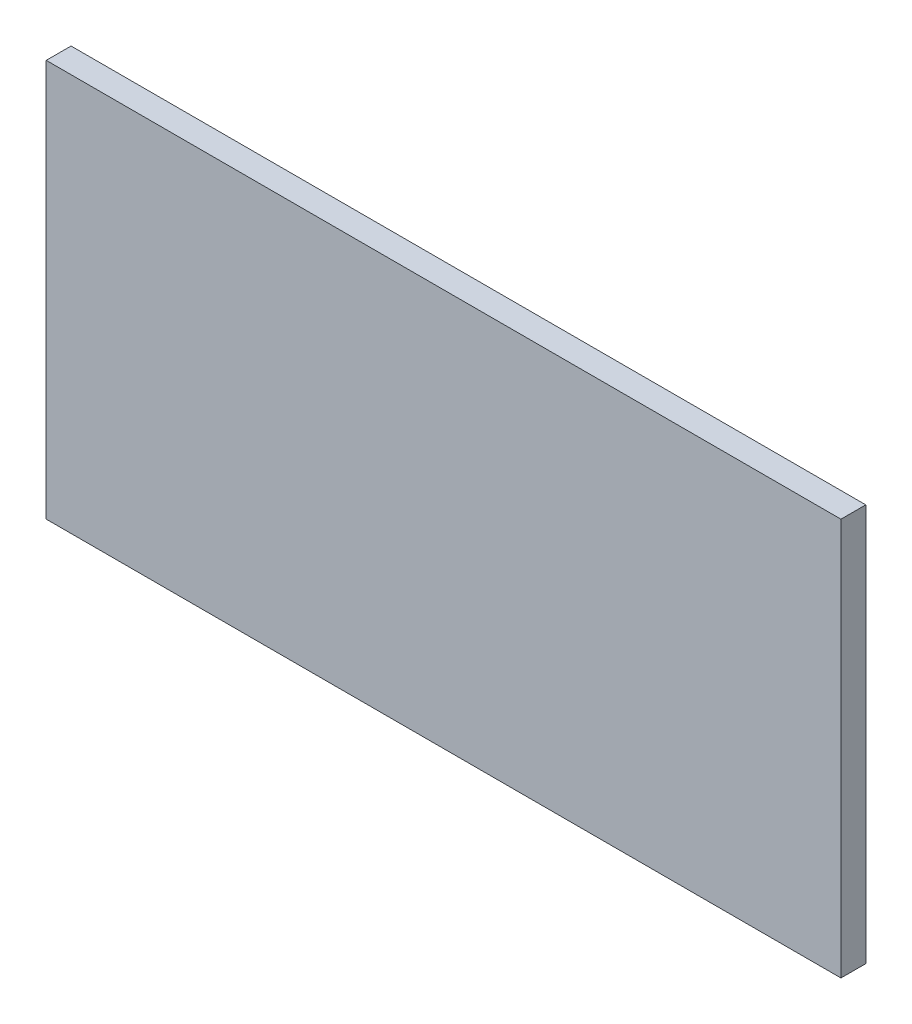
ISO-10303-21;
HEADER;
FILE_DESCRIPTION(('STEP AP214'),'2;1');
FILE_NAME('part.step','',(''),(''),'','','');
FILE_SCHEMA(('AUTOMOTIVE_DESIGN { 1 0 10303 214 1 1 1 1 }'));
ENDSEC;
DATA;
#1=APPLICATION_CONTEXT('core data for automotive mechanical design processes');
#2=APPLICATION_PROTOCOL_DEFINITION('international standard','automotive_design',2000,#1);
#3=PRODUCT_CONTEXT('',#1,'mechanical');
#4=PRODUCT('Part','Part','',(#3));
#5=PRODUCT_RELATED_PRODUCT_CATEGORY('part','',(#4));
#6=PRODUCT_DEFINITION_FORMATION('','',#4);
#7=PRODUCT_DEFINITION_CONTEXT('part definition',#1,'design');
#8=PRODUCT_DEFINITION('design','',#6,#7);
#9=PRODUCT_DEFINITION_SHAPE('','',#8);
#10=(LENGTH_UNIT() NAMED_UNIT(*) SI_UNIT(.MILLI.,.METRE.));
#11=(NAMED_UNIT(*) PLANE_ANGLE_UNIT() SI_UNIT($,.RADIAN.));
#12=(NAMED_UNIT(*) SI_UNIT($,.STERADIAN.) SOLID_ANGLE_UNIT());
#13=UNCERTAINTY_MEASURE_WITH_UNIT(LENGTH_MEASURE(1.E-05),#10,'distance_accuracy_value','');
#14=(GEOMETRIC_REPRESENTATION_CONTEXT(3) GLOBAL_UNCERTAINTY_ASSIGNED_CONTEXT((#13)) GLOBAL_UNIT_ASSIGNED_CONTEXT((#10,
#11,#12)) REPRESENTATION_CONTEXT('',''));
#15=CARTESIAN_POINT('',(0.,0.,0.));
#16=DIRECTION('',(0.,0.,1.));
#17=DIRECTION('',(1.,0.,0.));
#18=AXIS2_PLACEMENT_3D('',#15,#16,#17);
#19=CARTESIAN_POINT('',(0.,0.,3.175));
#20=DIRECTION('',(1.,0.,0.));
#21=DIRECTION('',(0.,1.,0.));
#22=AXIS2_PLACEMENT_3D('',#19,#20,#21);
#23=PLANE('',#22);
#24=DIRECTION('',(0.,-1.,0.));
#25=VECTOR('',#24,1.);
#26=CARTESIAN_POINT('',(0.,0.,0.));
#27=LINE('',#26,#25);
#28=CARTESIAN_POINT('',(0.,0.,0.));
#29=VERTEX_POINT('',#28);
#30=CARTESIAN_POINT('',(0.,-50.8,0.));
#31=VERTEX_POINT('',#30);
#32=EDGE_CURVE('E95',#29,#31,#27,.T.);
#33=ORIENTED_EDGE('',*,*,#32,.T.);
#34=DIRECTION('',(0.,0.,-1.));
#35=VECTOR('',#34,1.);
#36=CARTESIAN_POINT('',(0.,-50.8,3.175));
#37=LINE('',#36,#35);
#38=CARTESIAN_POINT('',(0.,-50.8,3.175));
#39=VERTEX_POINT('',#38);
#40=EDGE_CURVE('E11',#39,#31,#37,.T.);
#41=ORIENTED_EDGE('',*,*,#40,.F.);
#42=DIRECTION('',(0.,-1.,0.));
#43=VECTOR('',#42,1.);
#44=CARTESIAN_POINT('',(0.,0.,3.175));
#45=LINE('',#44,#43);
#46=CARTESIAN_POINT('',(0.,0.,3.175));
#47=VERTEX_POINT('',#46);
#48=EDGE_CURVE('E83',#47,#39,#45,.T.);
#49=ORIENTED_EDGE('',*,*,#48,.F.);
#50=DIRECTION('',(0.,0.,-1.));
#51=VECTOR('',#50,1.);
#52=CARTESIAN_POINT('',(0.,0.,3.175));
#53=LINE('',#52,#51);
#54=EDGE_CURVE('E91',#47,#29,#53,.T.);
#55=ORIENTED_EDGE('',*,*,#54,.T.);
#56=EDGE_LOOP('',(#33,#41,#49,#55));
#57=FACE_BOUND('',#56,.T.);
#58=ADVANCED_FACE('F32',(#57),#23,.F.);
#59=CARTESIAN_POINT('',(0.,-50.8,3.175));
#60=DIRECTION('',(0.,1.,0.));
#61=DIRECTION('',(0.,0.,1.));
#62=AXIS2_PLACEMENT_3D('',#59,#60,#61);
#63=PLANE('',#62);
#64=DIRECTION('',(1.,0.,0.));
#65=VECTOR('',#64,1.);
#66=CARTESIAN_POINT('',(0.,-50.8,0.));
#67=LINE('',#66,#65);
#68=CARTESIAN_POINT('',(101.6,-50.8,0.));
#69=VERTEX_POINT('',#68);
#70=EDGE_CURVE('E87',#31,#69,#67,.T.);
#71=ORIENTED_EDGE('',*,*,#70,.T.);
#72=DIRECTION('',(0.,0.,-1.));
#73=VECTOR('',#72,1.);
#74=CARTESIAN_POINT('',(101.6,-50.8,3.175));
#75=LINE('',#74,#73);
#76=CARTESIAN_POINT('',(101.6,-50.8,3.175));
#77=VERTEX_POINT('',#76);
#78=EDGE_CURVE('E40',#77,#69,#75,.T.);
#79=ORIENTED_EDGE('',*,*,#78,.F.);
#80=DIRECTION('',(1.,0.,0.));
#81=VECTOR('',#80,1.);
#82=CARTESIAN_POINT('',(0.,-50.8,3.175));
#83=LINE('',#82,#81);
#84=EDGE_CURVE('E78',#39,#77,#83,.T.);
#85=ORIENTED_EDGE('',*,*,#84,.F.);
#86=ORIENTED_EDGE('',*,*,#40,.T.);
#87=EDGE_LOOP('',(#71,#79,#85,#86));
#88=FACE_BOUND('',#87,.T.);
#89=ADVANCED_FACE('F86',(#88),#63,.F.);
#90=CARTESIAN_POINT('',(101.6,0.,3.175));
#91=DIRECTION('',(-1.,0.,0.));
#92=DIRECTION('',(0.,0.,1.));
#93=AXIS2_PLACEMENT_3D('',#90,#91,#92);
#94=PLANE('',#93);
#95=DIRECTION('',(0.,1.,0.));
#96=VECTOR('',#95,1.);
#97=CARTESIAN_POINT('',(101.6,0.,0.));
#98=LINE('',#97,#96);
#99=CARTESIAN_POINT('',(101.6,0.,0.));
#100=VERTEX_POINT('',#99);
#101=EDGE_CURVE('E65',#69,#100,#98,.T.);
#102=ORIENTED_EDGE('',*,*,#101,.T.);
#103=DIRECTION('',(0.,0.,-1.));
#104=VECTOR('',#103,1.);
#105=CARTESIAN_POINT('',(101.6,0.,3.175));
#106=LINE('',#105,#104);
#107=CARTESIAN_POINT('',(101.6,0.,3.175));
#108=VERTEX_POINT('',#107);
#109=EDGE_CURVE('E88',#108,#100,#106,.T.);
#110=ORIENTED_EDGE('',*,*,#109,.F.);
#111=DIRECTION('',(0.,1.,0.));
#112=VECTOR('',#111,1.);
#113=CARTESIAN_POINT('',(101.6,0.,3.175));
#114=LINE('',#113,#112);
#115=EDGE_CURVE('E81',#77,#108,#114,.T.);
#116=ORIENTED_EDGE('',*,*,#115,.F.);
#117=ORIENTED_EDGE('',*,*,#78,.T.);
#118=EDGE_LOOP('',(#102,#110,#116,#117));
#119=FACE_BOUND('',#118,.T.);
#120=ADVANCED_FACE('F89',(#119),#94,.F.);
#121=CARTESIAN_POINT('',(0.,0.,3.175));
#122=DIRECTION('',(0.,-1.,0.));
#123=DIRECTION('',(0.,0.,-1.));
#124=AXIS2_PLACEMENT_3D('',#121,#122,#123);
#125=PLANE('',#124);
#126=DIRECTION('',(-1.,0.,0.));
#127=VECTOR('',#126,1.);
#128=CARTESIAN_POINT('',(0.,0.,0.));
#129=LINE('',#128,#127);
#130=EDGE_CURVE('E71',#100,#29,#129,.T.);
#131=ORIENTED_EDGE('',*,*,#130,.T.);
#132=ORIENTED_EDGE('',*,*,#54,.F.);
#133=DIRECTION('',(-1.,0.,0.));
#134=VECTOR('',#133,1.);
#135=CARTESIAN_POINT('',(0.,0.,3.175));
#136=LINE('',#135,#134);
#137=EDGE_CURVE('E48',#108,#47,#136,.T.);
#138=ORIENTED_EDGE('',*,*,#137,.F.);
#139=ORIENTED_EDGE('',*,*,#109,.T.);
#140=EDGE_LOOP('',(#131,#132,#138,#139));
#141=FACE_BOUND('',#140,.T.);
#142=ADVANCED_FACE('F102',(#141),#125,.F.);
#143=CARTESIAN_POINT('',(0.,0.,3.175));
#144=DIRECTION('',(0.,0.,1.));
#145=DIRECTION('',(1.,0.,0.));
#146=AXIS2_PLACEMENT_3D('',#143,#144,#145);
#147=PLANE('',#146);
#148=ORIENTED_EDGE('',*,*,#48,.T.);
#149=ORIENTED_EDGE('',*,*,#84,.T.);
#150=ORIENTED_EDGE('',*,*,#115,.T.);
#151=ORIENTED_EDGE('',*,*,#137,.T.);
#152=EDGE_LOOP('',(#148,#149,#150,#151));
#153=FACE_BOUND('',#152,.T.);
#154=ADVANCED_FACE('F79',(#153),#147,.T.);
#155=CARTESIAN_POINT('',(0.,0.,0.));
#156=DIRECTION('',(0.,0.,1.));
#157=DIRECTION('',(1.,0.,0.));
#158=AXIS2_PLACEMENT_3D('',#155,#156,#157);
#159=PLANE('',#158);
#160=ORIENTED_EDGE('',*,*,#32,.F.);
#161=ORIENTED_EDGE('',*,*,#130,.F.);
#162=ORIENTED_EDGE('',*,*,#101,.F.);
#163=ORIENTED_EDGE('',*,*,#70,.F.);
#164=EDGE_LOOP('',(#160,#161,#162,#163));
#165=FACE_BOUND('',#164,.T.);
#166=ADVANCED_FACE('F105',(#165),#159,.F.);
#167=CLOSED_SHELL('',(#58,#89,#120,#142,#154,#166));
#168=MANIFOLD_SOLID_BREP('B2',#167);
#169=ADVANCED_BREP_SHAPE_REPRESENTATION('',(#18,#168),#14);
#170=SHAPE_DEFINITION_REPRESENTATION(#9,#169);
ENDSEC;
END-ISO-10303-21;
